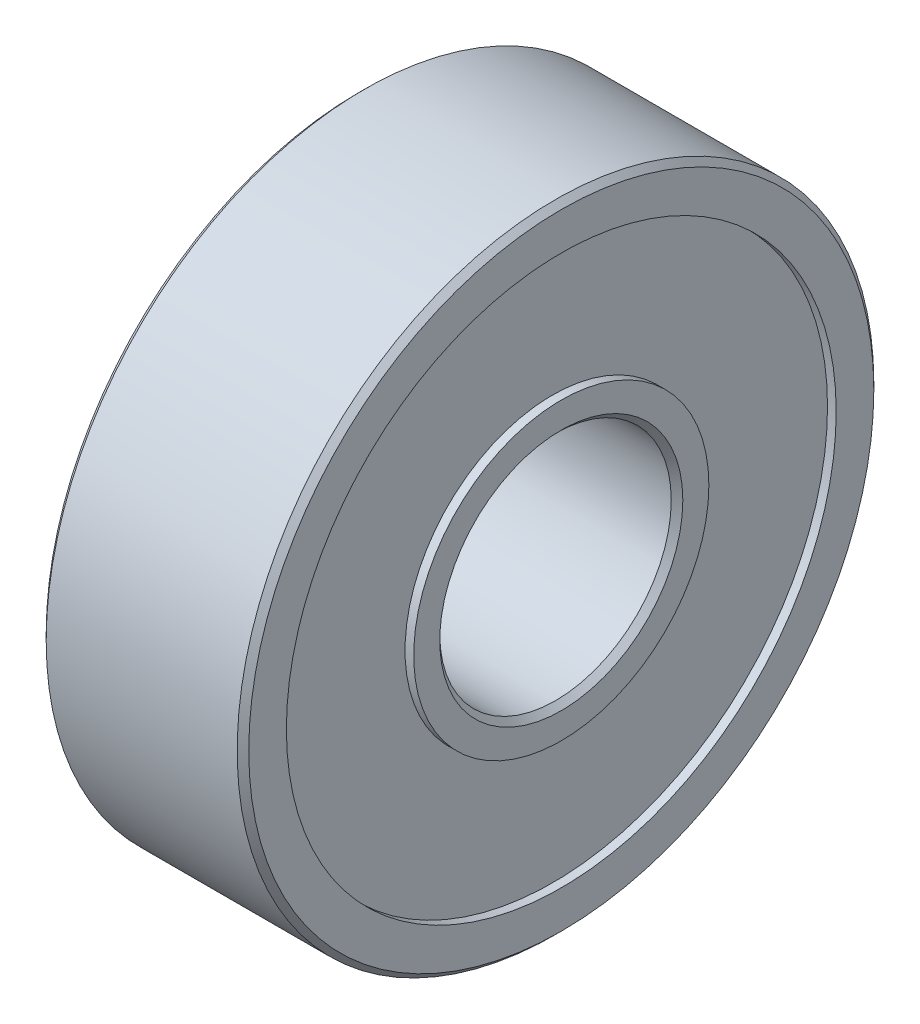
ISO-10303-21;
HEADER;
FILE_DESCRIPTION(('STEP AP214'),'2;1');
FILE_NAME('part.step','',(''),(''),'','','');
FILE_SCHEMA(('AUTOMOTIVE_DESIGN { 1 0 10303 214 1 1 1 1 }'));
ENDSEC;
DATA;
#1=APPLICATION_CONTEXT('core data for automotive mechanical design processes');
#2=APPLICATION_PROTOCOL_DEFINITION('international standard','automotive_design',2000,#1);
#3=PRODUCT_CONTEXT('',#1,'mechanical');
#4=PRODUCT('Part','Part','',(#3));
#5=PRODUCT_RELATED_PRODUCT_CATEGORY('part','',(#4));
#6=PRODUCT_DEFINITION_FORMATION('','',#4);
#7=PRODUCT_DEFINITION_CONTEXT('part definition',#1,'design');
#8=PRODUCT_DEFINITION('design','',#6,#7);
#9=PRODUCT_DEFINITION_SHAPE('','',#8);
#10=(LENGTH_UNIT() NAMED_UNIT(*) SI_UNIT(.MILLI.,.METRE.));
#11=(NAMED_UNIT(*) PLANE_ANGLE_UNIT() SI_UNIT($,.RADIAN.));
#12=(NAMED_UNIT(*) SI_UNIT($,.STERADIAN.) SOLID_ANGLE_UNIT());
#13=UNCERTAINTY_MEASURE_WITH_UNIT(LENGTH_MEASURE(1.E-05),#10,'distance_accuracy_value','');
#14=(GEOMETRIC_REPRESENTATION_CONTEXT(3) GLOBAL_UNCERTAINTY_ASSIGNED_CONTEXT((#13)) GLOBAL_UNIT_ASSIGNED_CONTEXT((#10,
#11,#12)) REPRESENTATION_CONTEXT('',''));
#15=CARTESIAN_POINT('',(0.,0.,0.));
#16=DIRECTION('',(0.,0.,1.));
#17=DIRECTION('',(1.,0.,0.));
#18=AXIS2_PLACEMENT_3D('',#15,#16,#17);
#19=CARTESIAN_POINT('',(-3.5,4.,0.));
#20=DIRECTION('',(-1.,0.,0.));
#21=DIRECTION('',(0.,0.,1.));
#22=AXIS2_PLACEMENT_3D('',#19,#20,#21);
#23=PLANE('',#22);
#24=CARTESIAN_POINT('',(-3.5,0.,0.));
#25=DIRECTION('',(-1.,0.,0.));
#26=DIRECTION('',(0.,0.,1.));
#27=AXIS2_PLACEMENT_3D('',#24,#25,#26);
#28=CIRCLE('',#27,4.2);
#29=CARTESIAN_POINT('',(-3.5,0.,4.2));
#30=VERTEX_POINT('',#29);
#31=EDGE_CURVE('E65',#30,#30,#28,.F.);
#32=ORIENTED_EDGE('',*,*,#31,.T.);
#33=EDGE_LOOP('',(#32));
#34=FACE_BOUND('',#33,.T.);
#35=CARTESIAN_POINT('',(-3.5,0.,0.));
#36=DIRECTION('',(1.,0.,0.));
#37=DIRECTION('',(0.,0.,-1.));
#38=AXIS2_PLACEMENT_3D('',#35,#36,#37);
#39=CIRCLE('',#38,5.1);
#40=CARTESIAN_POINT('',(-3.5,0.,-5.1));
#41=VERTEX_POINT('',#40);
#42=EDGE_CURVE('E68',#41,#41,#39,.T.);
#43=ORIENTED_EDGE('',*,*,#42,.F.);
#44=EDGE_LOOP('',(#43));
#45=FACE_BOUND('',#44,.T.);
#46=ADVANCED_FACE('F35',(#34,#45),#23,.T.);
#47=CARTESIAN_POINT('',(0.,0.,0.));
#48=DIRECTION('',(1.,0.,0.));
#49=DIRECTION('',(0.,0.,-1.));
#50=AXIS2_PLACEMENT_3D('',#47,#48,#49);
#51=CYLINDRICAL_SURFACE('',#50,5.1);
#52=ORIENTED_EDGE('',*,*,#42,.T.);
#53=EDGE_LOOP('',(#52));
#54=FACE_BOUND('',#53,.T.);
#55=CARTESIAN_POINT('',(-3.2,0.,0.));
#56=DIRECTION('',(1.,0.,0.));
#57=DIRECTION('',(0.,0.,-1.));
#58=AXIS2_PLACEMENT_3D('',#55,#56,#57);
#59=CIRCLE('',#58,5.1);
#60=CARTESIAN_POINT('',(-3.2,0.,-5.1));
#61=VERTEX_POINT('',#60);
#62=EDGE_CURVE('E71',#61,#61,#59,.T.);
#63=ORIENTED_EDGE('',*,*,#62,.F.);
#64=EDGE_LOOP('',(#63));
#65=FACE_BOUND('',#64,.T.);
#66=ADVANCED_FACE('F111',(#54,#65),#51,.T.);
#67=CARTESIAN_POINT('',(-3.2,5.1,0.));
#68=DIRECTION('',(-1.,0.,0.));
#69=DIRECTION('',(0.,0.,1.));
#70=AXIS2_PLACEMENT_3D('',#67,#68,#69);
#71=PLANE('',#70);
#72=ORIENTED_EDGE('',*,*,#62,.T.);
#73=EDGE_LOOP('',(#72));
#74=FACE_BOUND('',#73,.T.);
#75=CARTESIAN_POINT('',(-3.2,0.,0.));
#76=DIRECTION('',(1.,0.,0.));
#77=DIRECTION('',(0.,0.,-1.));
#78=AXIS2_PLACEMENT_3D('',#75,#76,#77);
#79=CIRCLE('',#78,9.5);
#80=CARTESIAN_POINT('',(-3.2,0.,-9.5));
#81=VERTEX_POINT('',#80);
#82=EDGE_CURVE('E74',#81,#81,#79,.T.);
#83=ORIENTED_EDGE('',*,*,#82,.F.);
#84=EDGE_LOOP('',(#83));
#85=FACE_BOUND('',#84,.T.);
#86=ADVANCED_FACE('F117',(#74,#85),#71,.T.);
#87=CARTESIAN_POINT('',(0.,0.,0.));
#88=DIRECTION('',(1.,0.,0.));
#89=DIRECTION('',(0.,0.,-1.));
#90=AXIS2_PLACEMENT_3D('',#87,#88,#89);
#91=CYLINDRICAL_SURFACE('',#90,9.5);
#92=ORIENTED_EDGE('',*,*,#82,.T.);
#93=EDGE_LOOP('',(#92));
#94=FACE_BOUND('',#93,.T.);
#95=CARTESIAN_POINT('',(-3.5,0.,0.));
#96=DIRECTION('',(1.,0.,0.));
#97=DIRECTION('',(0.,0.,-1.));
#98=AXIS2_PLACEMENT_3D('',#95,#96,#97);
#99=CIRCLE('',#98,9.5);
#100=CARTESIAN_POINT('',(-3.5,0.,-9.5));
#101=VERTEX_POINT('',#100);
#102=EDGE_CURVE('E77',#101,#101,#99,.T.);
#103=ORIENTED_EDGE('',*,*,#102,.F.);
#104=EDGE_LOOP('',(#103));
#105=FACE_BOUND('',#104,.T.);
#106=ADVANCED_FACE('F162',(#94,#105),#91,.F.);
#107=CARTESIAN_POINT('',(-3.5,9.5,0.));
#108=DIRECTION('',(-1.,0.,0.));
#109=DIRECTION('',(0.,0.,1.));
#110=AXIS2_PLACEMENT_3D('',#107,#108,#109);
#111=PLANE('',#110);
#112=CARTESIAN_POINT('',(-3.5,0.,0.));
#113=DIRECTION('',(-1.,0.,0.));
#114=DIRECTION('',(0.,0.,1.));
#115=AXIS2_PLACEMENT_3D('',#112,#113,#114);
#116=CIRCLE('',#115,10.8);
#117=CARTESIAN_POINT('',(-3.5,0.,10.8));
#118=VERTEX_POINT('',#117);
#119=EDGE_CURVE('E43',#118,#118,#116,.T.);
#120=ORIENTED_EDGE('',*,*,#119,.T.);
#121=EDGE_LOOP('',(#120));
#122=FACE_BOUND('',#121,.T.);
#123=ORIENTED_EDGE('',*,*,#102,.T.);
#124=EDGE_LOOP('',(#123));
#125=FACE_BOUND('',#124,.T.);
#126=ADVANCED_FACE('F153',(#122,#125),#111,.T.);
#127=CARTESIAN_POINT('',(0.,0.,0.));
#128=DIRECTION('',(1.,0.,0.));
#129=DIRECTION('',(0.,0.,-1.));
#130=AXIS2_PLACEMENT_3D('',#127,#128,#129);
#131=CYLINDRICAL_SURFACE('',#130,11.);
#132=CARTESIAN_POINT('',(-3.3,0.,0.));
#133=DIRECTION('',(-1.,0.,0.));
#134=DIRECTION('',(0.,0.,1.));
#135=AXIS2_PLACEMENT_3D('',#132,#133,#134);
#136=CIRCLE('',#135,11.);
#137=CARTESIAN_POINT('',(-3.3,0.,11.));
#138=VERTEX_POINT('',#137);
#139=EDGE_CURVE('E47',#138,#138,#136,.F.);
#140=ORIENTED_EDGE('',*,*,#139,.T.);
#141=EDGE_LOOP('',(#140));
#142=FACE_BOUND('',#141,.T.);
#143=CARTESIAN_POINT('',(3.3,0.,0.));
#144=DIRECTION('',(1.,0.,0.));
#145=DIRECTION('',(0.,0.,-1.));
#146=AXIS2_PLACEMENT_3D('',#143,#144,#145);
#147=CIRCLE('',#146,11.);
#148=CARTESIAN_POINT('',(3.3,0.,-11.));
#149=VERTEX_POINT('',#148);
#150=EDGE_CURVE('E51',#149,#149,#147,.F.);
#151=ORIENTED_EDGE('',*,*,#150,.T.);
#152=EDGE_LOOP('',(#151));
#153=FACE_BOUND('',#152,.T.);
#154=ADVANCED_FACE('F149',(#142,#153),#131,.T.);
#155=CARTESIAN_POINT('',(3.5,9.5,0.));
#156=DIRECTION('',(1.,0.,0.));
#157=DIRECTION('',(0.,0.,-1.));
#158=AXIS2_PLACEMENT_3D('',#155,#156,#157);
#159=PLANE('',#158);
#160=CARTESIAN_POINT('',(3.5,0.,0.));
#161=DIRECTION('',(1.,0.,0.));
#162=DIRECTION('',(0.,0.,-1.));
#163=AXIS2_PLACEMENT_3D('',#160,#161,#162);
#164=CIRCLE('',#163,10.8);
#165=CARTESIAN_POINT('',(3.5,0.,-10.8));
#166=VERTEX_POINT('',#165);
#167=EDGE_CURVE('E10',#166,#166,#164,.T.);
#168=ORIENTED_EDGE('',*,*,#167,.T.);
#169=EDGE_LOOP('',(#168));
#170=FACE_BOUND('',#169,.T.);
#171=CARTESIAN_POINT('',(3.5,0.,0.));
#172=DIRECTION('',(1.,0.,0.));
#173=DIRECTION('',(0.,0.,-1.));
#174=AXIS2_PLACEMENT_3D('',#171,#172,#173);
#175=CIRCLE('',#174,9.5);
#176=CARTESIAN_POINT('',(3.5,0.,-9.5));
#177=VERTEX_POINT('',#176);
#178=EDGE_CURVE('E80',#177,#177,#175,.T.);
#179=ORIENTED_EDGE('',*,*,#178,.F.);
#180=EDGE_LOOP('',(#179));
#181=FACE_BOUND('',#180,.T.);
#182=ADVANCED_FACE('F152',(#170,#181),#159,.T.);
#183=CARTESIAN_POINT('',(0.,0.,0.));
#184=DIRECTION('',(1.,0.,0.));
#185=DIRECTION('',(0.,0.,-1.));
#186=AXIS2_PLACEMENT_3D('',#183,#184,#185);
#187=CYLINDRICAL_SURFACE('',#186,9.5);
#188=ORIENTED_EDGE('',*,*,#178,.T.);
#189=EDGE_LOOP('',(#188));
#190=FACE_BOUND('',#189,.T.);
#191=CARTESIAN_POINT('',(3.2,0.,0.));
#192=DIRECTION('',(1.,0.,0.));
#193=DIRECTION('',(0.,0.,-1.));
#194=AXIS2_PLACEMENT_3D('',#191,#192,#193);
#195=CIRCLE('',#194,9.5);
#196=CARTESIAN_POINT('',(3.2,0.,-9.5));
#197=VERTEX_POINT('',#196);
#198=EDGE_CURVE('E83',#197,#197,#195,.T.);
#199=ORIENTED_EDGE('',*,*,#198,.F.);
#200=EDGE_LOOP('',(#199));
#201=FACE_BOUND('',#200,.T.);
#202=ADVANCED_FACE('F107',(#190,#201),#187,.F.);
#203=CARTESIAN_POINT('',(3.2,5.1,0.));
#204=DIRECTION('',(1.,0.,0.));
#205=DIRECTION('',(0.,0.,-1.));
#206=AXIS2_PLACEMENT_3D('',#203,#204,#205);
#207=PLANE('',#206);
#208=ORIENTED_EDGE('',*,*,#198,.T.);
#209=EDGE_LOOP('',(#208));
#210=FACE_BOUND('',#209,.T.);
#211=CARTESIAN_POINT('',(3.2,0.,0.));
#212=DIRECTION('',(1.,0.,0.));
#213=DIRECTION('',(0.,0.,-1.));
#214=AXIS2_PLACEMENT_3D('',#211,#212,#213);
#215=CIRCLE('',#214,5.1);
#216=CARTESIAN_POINT('',(3.2,0.,-5.1));
#217=VERTEX_POINT('',#216);
#218=EDGE_CURVE('E86',#217,#217,#215,.T.);
#219=ORIENTED_EDGE('',*,*,#218,.F.);
#220=EDGE_LOOP('',(#219));
#221=FACE_BOUND('',#220,.T.);
#222=ADVANCED_FACE('F97',(#210,#221),#207,.T.);
#223=CARTESIAN_POINT('',(0.,0.,0.));
#224=DIRECTION('',(1.,0.,0.));
#225=DIRECTION('',(0.,0.,-1.));
#226=AXIS2_PLACEMENT_3D('',#223,#224,#225);
#227=CYLINDRICAL_SURFACE('',#226,5.1);
#228=ORIENTED_EDGE('',*,*,#218,.T.);
#229=EDGE_LOOP('',(#228));
#230=FACE_BOUND('',#229,.T.);
#231=CARTESIAN_POINT('',(3.5,0.,0.));
#232=DIRECTION('',(1.,0.,0.));
#233=DIRECTION('',(0.,0.,-1.));
#234=AXIS2_PLACEMENT_3D('',#231,#232,#233);
#235=CIRCLE('',#234,5.1);
#236=CARTESIAN_POINT('',(3.5,0.,-5.1));
#237=VERTEX_POINT('',#236);
#238=EDGE_CURVE('E89',#237,#237,#235,.T.);
#239=ORIENTED_EDGE('',*,*,#238,.F.);
#240=EDGE_LOOP('',(#239));
#241=FACE_BOUND('',#240,.T.);
#242=ADVANCED_FACE('F95',(#230,#241),#227,.T.);
#243=CARTESIAN_POINT('',(3.5,4.,0.));
#244=DIRECTION('',(1.,0.,0.));
#245=DIRECTION('',(0.,0.,-1.));
#246=AXIS2_PLACEMENT_3D('',#243,#244,#245);
#247=PLANE('',#246);
#248=CARTESIAN_POINT('',(3.5,0.,0.));
#249=DIRECTION('',(1.,0.,0.));
#250=DIRECTION('',(0.,0.,-1.));
#251=AXIS2_PLACEMENT_3D('',#248,#249,#250);
#252=CIRCLE('',#251,4.19999999999999);
#253=CARTESIAN_POINT('',(3.5,0.,-4.19999999999999));
#254=VERTEX_POINT('',#253);
#255=EDGE_CURVE('E56',#254,#254,#252,.F.);
#256=ORIENTED_EDGE('',*,*,#255,.T.);
#257=EDGE_LOOP('',(#256));
#258=FACE_BOUND('',#257,.T.);
#259=ORIENTED_EDGE('',*,*,#238,.T.);
#260=EDGE_LOOP('',(#259));
#261=FACE_BOUND('',#260,.T.);
#262=ADVANCED_FACE('F93',(#258,#261),#247,.T.);
#263=CARTESIAN_POINT('',(0.,0.,0.));
#264=DIRECTION('',(1.,0.,0.));
#265=DIRECTION('',(0.,0.,-1.));
#266=AXIS2_PLACEMENT_3D('',#263,#264,#265);
#267=CYLINDRICAL_SURFACE('',#266,4.);
#268=CARTESIAN_POINT('',(-3.3,0.,0.));
#269=DIRECTION('',(-1.,0.,0.));
#270=DIRECTION('',(0.,0.,1.));
#271=AXIS2_PLACEMENT_3D('',#268,#269,#270);
#272=CIRCLE('',#271,4.);
#273=CARTESIAN_POINT('',(-3.3,0.,4.));
#274=VERTEX_POINT('',#273);
#275=EDGE_CURVE('E59',#274,#274,#272,.T.);
#276=ORIENTED_EDGE('',*,*,#275,.T.);
#277=EDGE_LOOP('',(#276));
#278=FACE_BOUND('',#277,.T.);
#279=CARTESIAN_POINT('',(3.30000000000001,0.,0.));
#280=DIRECTION('',(1.,0.,0.));
#281=DIRECTION('',(0.,0.,-1.));
#282=AXIS2_PLACEMENT_3D('',#279,#280,#281);
#283=CIRCLE('',#282,4.);
#284=CARTESIAN_POINT('',(3.30000000000001,0.,-4.));
#285=VERTEX_POINT('',#284);
#286=EDGE_CURVE('E62',#285,#285,#283,.T.);
#287=ORIENTED_EDGE('',*,*,#286,.T.);
#288=EDGE_LOOP('',(#287));
#289=FACE_BOUND('',#288,.T.);
#290=ADVANCED_FACE('F104',(#278,#289),#267,.F.);
#291=CARTESIAN_POINT('',(-3.5,0.,0.));
#292=DIRECTION('',(-1.,0.,0.));
#293=DIRECTION('',(0.,0.,1.));
#294=AXIS2_PLACEMENT_3D('',#291,#292,#293);
#295=CONICAL_SURFACE('',#294,4.2,0.785398163397448);
#296=ORIENTED_EDGE('',*,*,#275,.F.);
#297=EDGE_LOOP('',(#296));
#298=FACE_BOUND('',#297,.T.);
#299=ORIENTED_EDGE('',*,*,#31,.F.);
#300=EDGE_LOOP('',(#299));
#301=FACE_BOUND('',#300,.T.);
#302=ADVANCED_FACE('F124',(#298,#301),#295,.F.);
#303=CARTESIAN_POINT('',(3.30000000000001,0.,0.));
#304=DIRECTION('',(1.,0.,0.));
#305=DIRECTION('',(0.,0.,-1.));
#306=AXIS2_PLACEMENT_3D('',#303,#304,#305);
#307=CONICAL_SURFACE('',#306,4.,0.785398163397446);
#308=ORIENTED_EDGE('',*,*,#255,.F.);
#309=EDGE_LOOP('',(#308));
#310=FACE_BOUND('',#309,.T.);
#311=ORIENTED_EDGE('',*,*,#286,.F.);
#312=EDGE_LOOP('',(#311));
#313=FACE_BOUND('',#312,.T.);
#314=ADVANCED_FACE('F130',(#310,#313),#307,.F.);
#315=CARTESIAN_POINT('',(-3.3,0.,0.));
#316=DIRECTION('',(1.,0.,0.));
#317=DIRECTION('',(0.,0.,-1.));
#318=AXIS2_PLACEMENT_3D('',#315,#316,#317);
#319=CONICAL_SURFACE('',#318,11.,0.785398163397448);
#320=ORIENTED_EDGE('',*,*,#119,.F.);
#321=EDGE_LOOP('',(#320));
#322=FACE_BOUND('',#321,.T.);
#323=ORIENTED_EDGE('',*,*,#139,.F.);
#324=EDGE_LOOP('',(#323));
#325=FACE_BOUND('',#324,.T.);
#326=ADVANCED_FACE('F136',(#322,#325),#319,.T.);
#327=CARTESIAN_POINT('',(3.5,0.,0.));
#328=DIRECTION('',(-1.,0.,0.));
#329=DIRECTION('',(0.,0.,1.));
#330=AXIS2_PLACEMENT_3D('',#327,#328,#329);
#331=CONICAL_SURFACE('',#330,10.8,0.785398163397466);
#332=ORIENTED_EDGE('',*,*,#150,.F.);
#333=EDGE_LOOP('',(#332));
#334=FACE_BOUND('',#333,.T.);
#335=ORIENTED_EDGE('',*,*,#167,.F.);
#336=EDGE_LOOP('',(#335));
#337=FACE_BOUND('',#336,.T.);
#338=ADVANCED_FACE('F38',(#334,#337),#331,.T.);
#339=CLOSED_SHELL('',(#46,#66,#86,#106,#126,#154,#182,#202,#222,#242,#262,#290,#302,#314,#326,#338));
#340=MANIFOLD_SOLID_BREP('B2',#339);
#341=ADVANCED_BREP_SHAPE_REPRESENTATION('',(#18,#340),#14);
#342=SHAPE_DEFINITION_REPRESENTATION(#9,#341);
ENDSEC;
END-ISO-10303-21;
